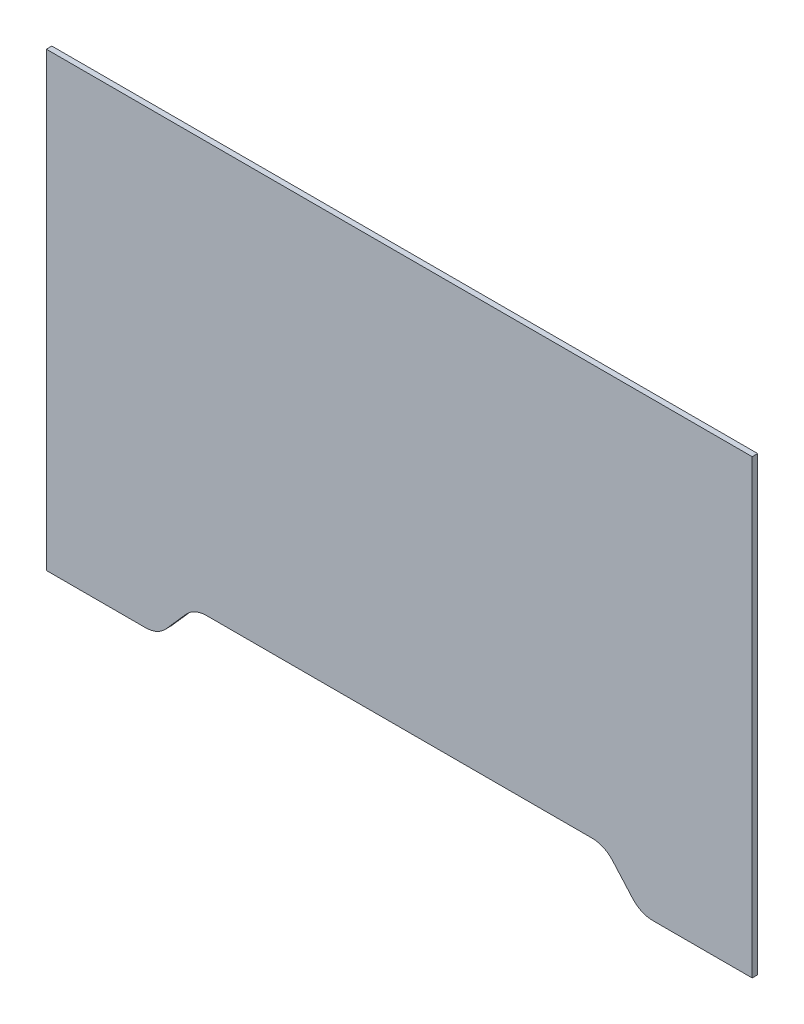
ISO-10303-21;
HEADER;
FILE_DESCRIPTION(('STEP AP214'),'2;1');
FILE_NAME('part.step','',(''),(''),'','','');
FILE_SCHEMA(('AUTOMOTIVE_DESIGN { 1 0 10303 214 1 1 1 1 }'));
ENDSEC;
DATA;
#1=APPLICATION_CONTEXT('core data for automotive mechanical design processes');
#2=APPLICATION_PROTOCOL_DEFINITION('international standard','automotive_design',2000,#1);
#3=PRODUCT_CONTEXT('',#1,'mechanical');
#4=PRODUCT('Part','Part','',(#3));
#5=PRODUCT_RELATED_PRODUCT_CATEGORY('part','',(#4));
#6=PRODUCT_DEFINITION_FORMATION('','',#4);
#7=PRODUCT_DEFINITION_CONTEXT('part definition',#1,'design');
#8=PRODUCT_DEFINITION('design','',#6,#7);
#9=PRODUCT_DEFINITION_SHAPE('','',#8);
#10=(LENGTH_UNIT() NAMED_UNIT(*) SI_UNIT(.MILLI.,.METRE.));
#11=(NAMED_UNIT(*) PLANE_ANGLE_UNIT() SI_UNIT($,.RADIAN.));
#12=(NAMED_UNIT(*) SI_UNIT($,.STERADIAN.) SOLID_ANGLE_UNIT());
#13=UNCERTAINTY_MEASURE_WITH_UNIT(LENGTH_MEASURE(1.E-05),#10,'distance_accuracy_value','');
#14=(GEOMETRIC_REPRESENTATION_CONTEXT(3) GLOBAL_UNCERTAINTY_ASSIGNED_CONTEXT((#13)) GLOBAL_UNIT_ASSIGNED_CONTEXT((#10,
#11,#12)) REPRESENTATION_CONTEXT('',''));
#15=CARTESIAN_POINT('',(0.,0.,0.));
#16=DIRECTION('',(0.,0.,1.));
#17=DIRECTION('',(1.,0.,0.));
#18=AXIS2_PLACEMENT_3D('',#15,#16,#17);
#19=CARTESIAN_POINT('',(257.999999999999,-165.,4.));
#20=DIRECTION('',(-1.,0.,0.));
#21=DIRECTION('',(0.,-1.,0.));
#22=AXIS2_PLACEMENT_3D('',#19,#20,#21);
#23=PLANE('',#22);
#24=DIRECTION('',(0.,1.,0.));
#25=VECTOR('',#24,1.);
#26=CARTESIAN_POINT('',(257.999999999999,-165.,0.));
#27=LINE('',#26,#25);
#28=CARTESIAN_POINT('',(257.999999999999,-165.,0.));
#29=VERTEX_POINT('',#28);
#30=CARTESIAN_POINT('',(258.,165.,0.));
#31=VERTEX_POINT('',#30);
#32=EDGE_CURVE('E155',#29,#31,#27,.T.);
#33=ORIENTED_EDGE('',*,*,#32,.T.);
#34=DIRECTION('',(0.,0.,-1.));
#35=VECTOR('',#34,1.);
#36=CARTESIAN_POINT('',(258.,165.,4.));
#37=LINE('',#36,#35);
#38=CARTESIAN_POINT('',(258.,165.,4.));
#39=VERTEX_POINT('',#38);
#40=EDGE_CURVE('E11',#39,#31,#37,.T.);
#41=ORIENTED_EDGE('',*,*,#40,.F.);
#42=DIRECTION('',(0.,1.,0.));
#43=VECTOR('',#42,1.);
#44=CARTESIAN_POINT('',(257.999999999999,-165.,4.));
#45=LINE('',#44,#43);
#46=CARTESIAN_POINT('',(257.999999999999,-165.,4.));
#47=VERTEX_POINT('',#46);
#48=EDGE_CURVE('E177',#47,#39,#45,.T.);
#49=ORIENTED_EDGE('',*,*,#48,.F.);
#50=DIRECTION('',(0.,0.,-1.));
#51=VECTOR('',#50,1.);
#52=CARTESIAN_POINT('',(257.999999999999,-165.,4.));
#53=LINE('',#52,#51);
#54=EDGE_CURVE('E151',#47,#29,#53,.T.);
#55=ORIENTED_EDGE('',*,*,#54,.T.);
#56=EDGE_LOOP('',(#33,#41,#49,#55));
#57=FACE_BOUND('',#56,.T.);
#58=ADVANCED_FACE('F35',(#57),#23,.F.);
#59=CARTESIAN_POINT('',(-258.000000000001,165.,4.));
#60=DIRECTION('',(0.,-1.,0.));
#61=DIRECTION('',(0.,0.,-1.));
#62=AXIS2_PLACEMENT_3D('',#59,#60,#61);
#63=PLANE('',#62);
#64=DIRECTION('',(-1.,0.,0.));
#65=VECTOR('',#64,1.);
#66=CARTESIAN_POINT('',(-258.000000000001,165.,0.));
#67=LINE('',#66,#65);
#68=CARTESIAN_POINT('',(-258.000000000001,165.,0.));
#69=VERTEX_POINT('',#68);
#70=EDGE_CURVE('E158',#31,#69,#67,.T.);
#71=ORIENTED_EDGE('',*,*,#70,.T.);
#72=DIRECTION('',(0.,0.,-1.));
#73=VECTOR('',#72,1.);
#74=CARTESIAN_POINT('',(-258.000000000001,165.,4.));
#75=LINE('',#74,#73);
#76=CARTESIAN_POINT('',(-258.000000000001,165.,4.));
#77=VERTEX_POINT('',#76);
#78=EDGE_CURVE('E43',#77,#69,#75,.T.);
#79=ORIENTED_EDGE('',*,*,#78,.F.);
#80=DIRECTION('',(-1.,0.,0.));
#81=VECTOR('',#80,1.);
#82=CARTESIAN_POINT('',(-258.000000000001,165.,4.));
#83=LINE('',#82,#81);
#84=EDGE_CURVE('E106',#39,#77,#83,.T.);
#85=ORIENTED_EDGE('',*,*,#84,.F.);
#86=ORIENTED_EDGE('',*,*,#40,.T.);
#87=EDGE_LOOP('',(#71,#79,#85,#86));
#88=FACE_BOUND('',#87,.T.);
#89=ADVANCED_FACE('F255',(#88),#63,.F.);
#90=CARTESIAN_POINT('',(-258.000000000001,-165.,4.));
#91=DIRECTION('',(1.,0.,0.));
#92=DIRECTION('',(0.,0.,-1.));
#93=AXIS2_PLACEMENT_3D('',#90,#91,#92);
#94=PLANE('',#93);
#95=DIRECTION('',(0.,-1.,0.));
#96=VECTOR('',#95,1.);
#97=CARTESIAN_POINT('',(-258.000000000001,-165.,0.));
#98=LINE('',#97,#96);
#99=CARTESIAN_POINT('',(-258.000000000001,-165.,0.));
#100=VERTEX_POINT('',#99);
#101=EDGE_CURVE('E160',#69,#100,#98,.T.);
#102=ORIENTED_EDGE('',*,*,#101,.T.);
#103=DIRECTION('',(0.,0.,-1.));
#104=VECTOR('',#103,1.);
#105=CARTESIAN_POINT('',(-258.000000000001,-165.,4.));
#106=LINE('',#105,#104);
#107=CARTESIAN_POINT('',(-258.000000000001,-165.,4.));
#108=VERTEX_POINT('',#107);
#109=EDGE_CURVE('E196',#108,#100,#106,.T.);
#110=ORIENTED_EDGE('',*,*,#109,.F.);
#111=DIRECTION('',(0.,-1.,0.));
#112=VECTOR('',#111,1.);
#113=CARTESIAN_POINT('',(-258.000000000001,-165.,4.));
#114=LINE('',#113,#112);
#115=EDGE_CURVE('E204',#77,#108,#114,.T.);
#116=ORIENTED_EDGE('',*,*,#115,.F.);
#117=ORIENTED_EDGE('',*,*,#78,.T.);
#118=EDGE_LOOP('',(#102,#110,#116,#117));
#119=FACE_BOUND('',#118,.T.);
#120=ADVANCED_FACE('F202',(#119),#94,.F.);
#121=CARTESIAN_POINT('',(-258.000000000001,-165.,4.));
#122=DIRECTION('',(0.,1.,0.));
#123=DIRECTION('',(0.,0.,1.));
#124=AXIS2_PLACEMENT_3D('',#121,#122,#123);
#125=PLANE('',#124);
#126=DIRECTION('',(1.,0.,0.));
#127=VECTOR('',#126,1.);
#128=CARTESIAN_POINT('',(-258.000000000001,-165.,0.));
#129=LINE('',#128,#127);
#130=CARTESIAN_POINT('',(-185.485837703549,-165.,0.));
#131=VERTEX_POINT('',#130);
#132=EDGE_CURVE('E162',#100,#131,#129,.T.);
#133=ORIENTED_EDGE('',*,*,#132,.T.);
#134=DIRECTION('',(0.,0.,-1.));
#135=VECTOR('',#134,1.);
#136=CARTESIAN_POINT('',(-185.485837703549,-165.,4.));
#137=LINE('',#136,#135);
#138=CARTESIAN_POINT('',(-185.485837703549,-165.,4.));
#139=VERTEX_POINT('',#138);
#140=EDGE_CURVE('E193',#139,#131,#137,.T.);
#141=ORIENTED_EDGE('',*,*,#140,.F.);
#142=DIRECTION('',(1.,0.,0.));
#143=VECTOR('',#142,1.);
#144=CARTESIAN_POINT('',(-258.000000000001,-165.,4.));
#145=LINE('',#144,#143);
#146=EDGE_CURVE('E222',#108,#139,#145,.T.);
#147=ORIENTED_EDGE('',*,*,#146,.F.);
#148=ORIENTED_EDGE('',*,*,#109,.T.);
#149=EDGE_LOOP('',(#133,#141,#147,#148));
#150=FACE_BOUND('',#149,.T.);
#151=ADVANCED_FACE('F213',(#150),#125,.F.);
#152=CARTESIAN_POINT('',(-185.485837703549,-145.,4.));
#153=DIRECTION('',(0.,0.,-1.));
#154=DIRECTION('',(-1.,0.,0.));
#155=AXIS2_PLACEMENT_3D('',#152,#153,#154);
#156=CYLINDRICAL_SURFACE('',#155,20.);
#157=CARTESIAN_POINT('',(-185.485837703549,-145.,0.));
#158=DIRECTION('',(0.,0.,1.));
#159=DIRECTION('',(-1.,0.,0.));
#160=AXIS2_PLACEMENT_3D('',#157,#158,#159);
#161=CIRCLE('',#160,20.);
#162=CARTESIAN_POINT('',(-170.485837703549,-158.228756555323,0.));
#163=VERTEX_POINT('',#162);
#164=EDGE_CURVE('E164',#131,#163,#161,.T.);
#165=ORIENTED_EDGE('',*,*,#164,.T.);
#166=DIRECTION('',(0.,0.,-1.));
#167=VECTOR('',#166,1.);
#168=CARTESIAN_POINT('',(-170.485837703549,-158.228756555323,4.));
#169=LINE('',#168,#167);
#170=CARTESIAN_POINT('',(-170.485837703549,-158.228756555323,4.));
#171=VERTEX_POINT('',#170);
#172=EDGE_CURVE('E190',#171,#163,#169,.T.);
#173=ORIENTED_EDGE('',*,*,#172,.F.);
#174=CARTESIAN_POINT('',(-185.485837703549,-145.,4.));
#175=DIRECTION('',(0.,0.,1.));
#176=DIRECTION('',(-1.,0.,0.));
#177=AXIS2_PLACEMENT_3D('',#174,#175,#176);
#178=CIRCLE('',#177,20.);
#179=EDGE_CURVE('E219',#139,#171,#178,.T.);
#180=ORIENTED_EDGE('',*,*,#179,.F.);
#181=ORIENTED_EDGE('',*,*,#140,.T.);
#182=EDGE_LOOP('',(#165,#173,#180,#181));
#183=FACE_BOUND('',#182,.T.);
#184=ADVANCED_FACE('F217',(#183),#156,.T.);
#185=CARTESIAN_POINT('',(-170.485837703549,-158.228756555323,4.));
#186=DIRECTION('',(-0.750000000000001,0.661437827766147,0.));
#187=DIRECTION('',(-0.661437827766147,-0.750000000000001,0.));
#188=AXIS2_PLACEMENT_3D('',#185,#186,#187);
#189=PLANE('',#188);
#190=DIRECTION('',(0.661437827766147,0.750000000000001,0.));
#191=VECTOR('',#190,1.);
#192=CARTESIAN_POINT('',(-170.485837703549,-158.228756555323,0.));
#193=LINE('',#192,#191);
#194=CARTESIAN_POINT('',(-155.971675407098,-141.771243444677,0.));
#195=VERTEX_POINT('',#194);
#196=EDGE_CURVE('E166',#163,#195,#193,.T.);
#197=ORIENTED_EDGE('',*,*,#196,.T.);
#198=DIRECTION('',(0.,0.,-1.));
#199=VECTOR('',#198,1.);
#200=CARTESIAN_POINT('',(-155.971675407098,-141.771243444677,4.));
#201=LINE('',#200,#199);
#202=CARTESIAN_POINT('',(-155.971675407098,-141.771243444677,4.));
#203=VERTEX_POINT('',#202);
#204=EDGE_CURVE('E187',#203,#195,#201,.T.);
#205=ORIENTED_EDGE('',*,*,#204,.F.);
#206=DIRECTION('',(0.661437827766147,0.750000000000001,0.));
#207=VECTOR('',#206,1.);
#208=CARTESIAN_POINT('',(-170.485837703549,-158.228756555323,4.));
#209=LINE('',#208,#207);
#210=EDGE_CURVE('E221',#171,#203,#209,.T.);
#211=ORIENTED_EDGE('',*,*,#210,.F.);
#212=ORIENTED_EDGE('',*,*,#172,.T.);
#213=EDGE_LOOP('',(#197,#205,#211,#212));
#214=FACE_BOUND('',#213,.T.);
#215=ADVANCED_FACE('F268',(#214),#189,.F.);
#216=CARTESIAN_POINT('',(-140.971675407098,-155.,4.));
#217=DIRECTION('',(0.,0.,-1.));
#218=DIRECTION('',(-1.,0.,0.));
#219=AXIS2_PLACEMENT_3D('',#216,#217,#218);
#220=CYLINDRICAL_SURFACE('',#219,20.);
#221=CARTESIAN_POINT('',(-140.971675407098,-155.,0.));
#222=DIRECTION('',(0.,0.,-1.));
#223=DIRECTION('',(-1.,0.,0.));
#224=AXIS2_PLACEMENT_3D('',#221,#222,#223);
#225=CIRCLE('',#224,20.);
#226=CARTESIAN_POINT('',(-140.971675407098,-135.,0.));
#227=VERTEX_POINT('',#226);
#228=EDGE_CURVE('E168',#195,#227,#225,.T.);
#229=ORIENTED_EDGE('',*,*,#228,.T.);
#230=DIRECTION('',(0.,0.,-1.));
#231=VECTOR('',#230,1.);
#232=CARTESIAN_POINT('',(-140.971675407098,-135.,4.));
#233=LINE('',#232,#231);
#234=CARTESIAN_POINT('',(-140.971675407098,-135.,4.));
#235=VERTEX_POINT('',#234);
#236=EDGE_CURVE('E184',#235,#227,#233,.T.);
#237=ORIENTED_EDGE('',*,*,#236,.F.);
#238=CARTESIAN_POINT('',(-140.971675407098,-155.,4.));
#239=DIRECTION('',(0.,0.,-1.));
#240=DIRECTION('',(-1.,0.,0.));
#241=AXIS2_PLACEMENT_3D('',#238,#239,#240);
#242=CIRCLE('',#241,20.);
#243=EDGE_CURVE('E224',#203,#235,#242,.T.);
#244=ORIENTED_EDGE('',*,*,#243,.F.);
#245=ORIENTED_EDGE('',*,*,#204,.T.);
#246=EDGE_LOOP('',(#229,#237,#244,#245));
#247=FACE_BOUND('',#246,.T.);
#248=ADVANCED_FACE('F271',(#247),#220,.F.);
#249=CARTESIAN_POINT('',(-140.971675407098,-135.,4.));
#250=DIRECTION('',(0.,1.,0.));
#251=DIRECTION('',(0.,0.,1.));
#252=AXIS2_PLACEMENT_3D('',#249,#250,#251);
#253=PLANE('',#252);
#254=DIRECTION('',(1.,0.,0.));
#255=VECTOR('',#254,1.);
#256=CARTESIAN_POINT('',(-140.971675407098,-135.,0.));
#257=LINE('',#256,#255);
#258=CARTESIAN_POINT('',(140.971675407097,-135.,0.));
#259=VERTEX_POINT('',#258);
#260=EDGE_CURVE('E170',#227,#259,#257,.T.);
#261=ORIENTED_EDGE('',*,*,#260,.T.);
#262=DIRECTION('',(0.,0.,-1.));
#263=VECTOR('',#262,1.);
#264=CARTESIAN_POINT('',(140.971675407097,-135.,4.));
#265=LINE('',#264,#263);
#266=CARTESIAN_POINT('',(140.971675407097,-135.,4.));
#267=VERTEX_POINT('',#266);
#268=EDGE_CURVE('E181',#267,#259,#265,.T.);
#269=ORIENTED_EDGE('',*,*,#268,.F.);
#270=DIRECTION('',(1.,0.,0.));
#271=VECTOR('',#270,1.);
#272=CARTESIAN_POINT('',(-140.971675407098,-135.,4.));
#273=LINE('',#272,#271);
#274=EDGE_CURVE('E230',#235,#267,#273,.T.);
#275=ORIENTED_EDGE('',*,*,#274,.F.);
#276=ORIENTED_EDGE('',*,*,#236,.T.);
#277=EDGE_LOOP('',(#261,#269,#275,#276));
#278=FACE_BOUND('',#277,.T.);
#279=ADVANCED_FACE('F236',(#278),#253,.F.);
#280=CARTESIAN_POINT('',(140.971675407097,-155.,4.));
#281=DIRECTION('',(0.,0.,-1.));
#282=DIRECTION('',(-1.,0.,0.));
#283=AXIS2_PLACEMENT_3D('',#280,#281,#282);
#284=CYLINDRICAL_SURFACE('',#283,20.);
#285=CARTESIAN_POINT('',(140.971675407097,-155.,0.));
#286=DIRECTION('',(0.,0.,-1.));
#287=DIRECTION('',(-1.,0.,0.));
#288=AXIS2_PLACEMENT_3D('',#285,#286,#287);
#289=CIRCLE('',#288,20.);
#290=CARTESIAN_POINT('',(155.971675407097,-141.771243444677,0.));
#291=VERTEX_POINT('',#290);
#292=EDGE_CURVE('E172',#259,#291,#289,.T.);
#293=ORIENTED_EDGE('',*,*,#292,.T.);
#294=DIRECTION('',(0.,0.,-1.));
#295=VECTOR('',#294,1.);
#296=CARTESIAN_POINT('',(155.971675407097,-141.771243444677,4.));
#297=LINE('',#296,#295);
#298=CARTESIAN_POINT('',(155.971675407097,-141.771243444677,4.));
#299=VERTEX_POINT('',#298);
#300=EDGE_CURVE('E146',#299,#291,#297,.T.);
#301=ORIENTED_EDGE('',*,*,#300,.F.);
#302=CARTESIAN_POINT('',(140.971675407097,-155.,4.));
#303=DIRECTION('',(0.,0.,-1.));
#304=DIRECTION('',(-1.,0.,0.));
#305=AXIS2_PLACEMENT_3D('',#302,#303,#304);
#306=CIRCLE('',#305,20.);
#307=EDGE_CURVE('E137',#267,#299,#306,.T.);
#308=ORIENTED_EDGE('',*,*,#307,.F.);
#309=ORIENTED_EDGE('',*,*,#268,.T.);
#310=EDGE_LOOP('',(#293,#301,#308,#309));
#311=FACE_BOUND('',#310,.T.);
#312=ADVANCED_FACE('F240',(#311),#284,.F.);
#313=CARTESIAN_POINT('',(155.971675407097,-141.771243444677,4.));
#314=DIRECTION('',(0.75,0.661437827766148,0.));
#315=DIRECTION('',(-0.661437827766148,0.75,0.));
#316=AXIS2_PLACEMENT_3D('',#313,#314,#315);
#317=PLANE('',#316);
#318=DIRECTION('',(0.661437827766148,-0.75,0.));
#319=VECTOR('',#318,1.);
#320=CARTESIAN_POINT('',(155.971675407097,-141.771243444677,0.));
#321=LINE('',#320,#319);
#322=CARTESIAN_POINT('',(170.485837703548,-158.228756555323,0.));
#323=VERTEX_POINT('',#322);
#324=EDGE_CURVE('E145',#291,#323,#321,.T.);
#325=ORIENTED_EDGE('',*,*,#324,.T.);
#326=DIRECTION('',(0.,0.,-1.));
#327=VECTOR('',#326,1.);
#328=CARTESIAN_POINT('',(170.485837703548,-158.228756555323,4.));
#329=LINE('',#328,#327);
#330=CARTESIAN_POINT('',(170.485837703548,-158.228756555323,4.));
#331=VERTEX_POINT('',#330);
#332=EDGE_CURVE('E142',#331,#323,#329,.T.);
#333=ORIENTED_EDGE('',*,*,#332,.F.);
#334=DIRECTION('',(0.661437827766148,-0.75,0.));
#335=VECTOR('',#334,1.);
#336=CARTESIAN_POINT('',(155.971675407097,-141.771243444677,4.));
#337=LINE('',#336,#335);
#338=EDGE_CURVE('E131',#299,#331,#337,.T.);
#339=ORIENTED_EDGE('',*,*,#338,.F.);
#340=ORIENTED_EDGE('',*,*,#300,.T.);
#341=EDGE_LOOP('',(#325,#333,#339,#340));
#342=FACE_BOUND('',#341,.T.);
#343=ADVANCED_FACE('F143',(#342),#317,.F.);
#344=CARTESIAN_POINT('',(185.485837703548,-145.,4.));
#345=DIRECTION('',(0.,0.,-1.));
#346=DIRECTION('',(-1.,0.,0.));
#347=AXIS2_PLACEMENT_3D('',#344,#345,#346);
#348=CYLINDRICAL_SURFACE('',#347,20.);
#349=CARTESIAN_POINT('',(185.485837703548,-145.,0.));
#350=DIRECTION('',(0.,0.,1.));
#351=DIRECTION('',(1.,0.,0.));
#352=AXIS2_PLACEMENT_3D('',#349,#350,#351);
#353=CIRCLE('',#352,20.);
#354=CARTESIAN_POINT('',(185.485837703548,-165.,0.));
#355=VERTEX_POINT('',#354);
#356=EDGE_CURVE('E92',#323,#355,#353,.T.);
#357=ORIENTED_EDGE('',*,*,#356,.T.);
#358=DIRECTION('',(0.,0.,-1.));
#359=VECTOR('',#358,1.);
#360=CARTESIAN_POINT('',(185.485837703548,-165.,4.));
#361=LINE('',#360,#359);
#362=CARTESIAN_POINT('',(185.485837703548,-165.,4.));
#363=VERTEX_POINT('',#362);
#364=EDGE_CURVE('E147',#363,#355,#361,.T.);
#365=ORIENTED_EDGE('',*,*,#364,.F.);
#366=CARTESIAN_POINT('',(185.485837703548,-145.,4.));
#367=DIRECTION('',(0.,0.,1.));
#368=DIRECTION('',(1.,0.,0.));
#369=AXIS2_PLACEMENT_3D('',#366,#367,#368);
#370=CIRCLE('',#369,20.);
#371=EDGE_CURVE('E135',#331,#363,#370,.T.);
#372=ORIENTED_EDGE('',*,*,#371,.F.);
#373=ORIENTED_EDGE('',*,*,#332,.T.);
#374=EDGE_LOOP('',(#357,#365,#372,#373));
#375=FACE_BOUND('',#374,.T.);
#376=ADVANCED_FACE('F149',(#375),#348,.T.);
#377=CARTESIAN_POINT('',(185.485837703548,-165.,4.));
#378=DIRECTION('',(0.,1.,0.));
#379=DIRECTION('',(0.,0.,1.));
#380=AXIS2_PLACEMENT_3D('',#377,#378,#379);
#381=PLANE('',#380);
#382=DIRECTION('',(1.,0.,0.));
#383=VECTOR('',#382,1.);
#384=CARTESIAN_POINT('',(185.485837703548,-165.,0.));
#385=LINE('',#384,#383);
#386=EDGE_CURVE('E98',#355,#29,#385,.T.);
#387=ORIENTED_EDGE('',*,*,#386,.T.);
#388=ORIENTED_EDGE('',*,*,#54,.F.);
#389=DIRECTION('',(1.,0.,0.));
#390=VECTOR('',#389,1.);
#391=CARTESIAN_POINT('',(185.485837703548,-165.,4.));
#392=LINE('',#391,#390);
#393=EDGE_CURVE('E51',#363,#47,#392,.T.);
#394=ORIENTED_EDGE('',*,*,#393,.F.);
#395=ORIENTED_EDGE('',*,*,#364,.T.);
#396=EDGE_LOOP('',(#387,#388,#394,#395));
#397=FACE_BOUND('',#396,.T.);
#398=ADVANCED_FACE('F244',(#397),#381,.F.);
#399=CARTESIAN_POINT('',(-185.485837703549,-145.,4.));
#400=DIRECTION('',(0.,0.,-1.));
#401=DIRECTION('',(-1.,0.,0.));
#402=AXIS2_PLACEMENT_3D('',#399,#400,#401);
#403=PLANE('',#402);
#404=ORIENTED_EDGE('',*,*,#48,.T.);
#405=ORIENTED_EDGE('',*,*,#84,.T.);
#406=ORIENTED_EDGE('',*,*,#115,.T.);
#407=ORIENTED_EDGE('',*,*,#146,.T.);
#408=ORIENTED_EDGE('',*,*,#179,.T.);
#409=ORIENTED_EDGE('',*,*,#210,.T.);
#410=ORIENTED_EDGE('',*,*,#243,.T.);
#411=ORIENTED_EDGE('',*,*,#274,.T.);
#412=ORIENTED_EDGE('',*,*,#307,.T.);
#413=ORIENTED_EDGE('',*,*,#338,.T.);
#414=ORIENTED_EDGE('',*,*,#371,.T.);
#415=ORIENTED_EDGE('',*,*,#393,.T.);
#416=EDGE_LOOP('',(#404,#405,#406,#407,#408,#409,#410,#411,#412,#413,#414,#415));
#417=FACE_BOUND('',#416,.T.);
#418=ADVANCED_FACE('F133',(#417),#403,.F.);
#419=CARTESIAN_POINT('',(-185.485837703549,-145.,0.));
#420=DIRECTION('',(0.,0.,-1.));
#421=DIRECTION('',(-1.,0.,0.));
#422=AXIS2_PLACEMENT_3D('',#419,#420,#421);
#423=PLANE('',#422);
#424=ORIENTED_EDGE('',*,*,#32,.F.);
#425=ORIENTED_EDGE('',*,*,#386,.F.);
#426=ORIENTED_EDGE('',*,*,#356,.F.);
#427=ORIENTED_EDGE('',*,*,#324,.F.);
#428=ORIENTED_EDGE('',*,*,#292,.F.);
#429=ORIENTED_EDGE('',*,*,#260,.F.);
#430=ORIENTED_EDGE('',*,*,#228,.F.);
#431=ORIENTED_EDGE('',*,*,#196,.F.);
#432=ORIENTED_EDGE('',*,*,#164,.F.);
#433=ORIENTED_EDGE('',*,*,#132,.F.);
#434=ORIENTED_EDGE('',*,*,#101,.F.);
#435=ORIENTED_EDGE('',*,*,#70,.F.);
#436=EDGE_LOOP('',(#424,#425,#426,#427,#428,#429,#430,#431,#432,#433,#434,#435));
#437=FACE_BOUND('',#436,.T.);
#438=ADVANCED_FACE('F208',(#437),#423,.T.);
#439=CLOSED_SHELL('',(#58,#89,#120,#151,#184,#215,#248,#279,#312,#343,#376,#398,#418,#438));
#440=MANIFOLD_SOLID_BREP('B2',#439);
#441=ADVANCED_BREP_SHAPE_REPRESENTATION('',(#18,#440),#14);
#442=SHAPE_DEFINITION_REPRESENTATION(#9,#441);
ENDSEC;
END-ISO-10303-21;
